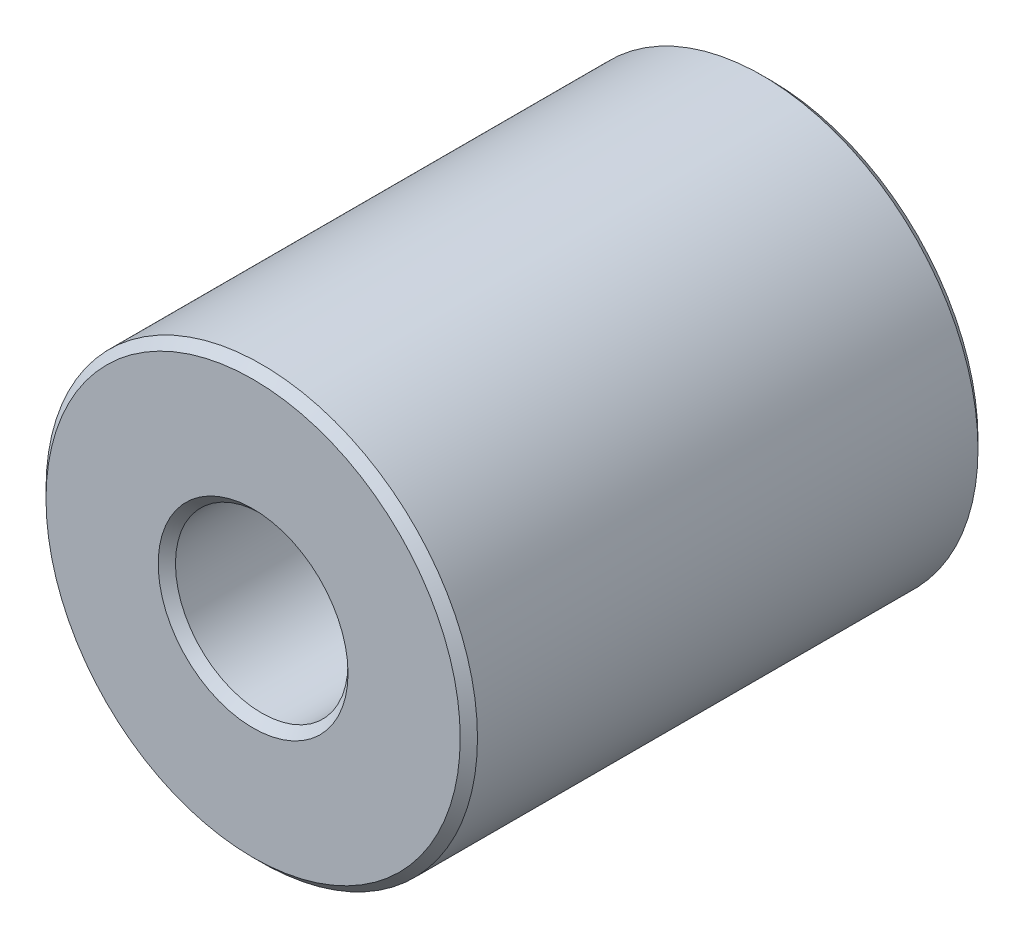
ISO-10303-21;
HEADER;
FILE_DESCRIPTION(('STEP AP214'),'2;1');
FILE_NAME('part.step','',(''),(''),'','','');
FILE_SCHEMA(('AUTOMOTIVE_DESIGN { 1 0 10303 214 1 1 1 1 }'));
ENDSEC;
DATA;
#1=APPLICATION_CONTEXT('core data for automotive mechanical design processes');
#2=APPLICATION_PROTOCOL_DEFINITION('international standard','automotive_design',2000,#1);
#3=PRODUCT_CONTEXT('',#1,'mechanical');
#4=PRODUCT('Part','Part','',(#3));
#5=PRODUCT_RELATED_PRODUCT_CATEGORY('part','',(#4));
#6=PRODUCT_DEFINITION_FORMATION('','',#4);
#7=PRODUCT_DEFINITION_CONTEXT('part definition',#1,'design');
#8=PRODUCT_DEFINITION('design','',#6,#7);
#9=PRODUCT_DEFINITION_SHAPE('','',#8);
#10=(LENGTH_UNIT() NAMED_UNIT(*) SI_UNIT(.MILLI.,.METRE.));
#11=(NAMED_UNIT(*) PLANE_ANGLE_UNIT() SI_UNIT($,.RADIAN.));
#12=(NAMED_UNIT(*) SI_UNIT($,.STERADIAN.) SOLID_ANGLE_UNIT());
#13=UNCERTAINTY_MEASURE_WITH_UNIT(LENGTH_MEASURE(1.E-05),#10,'distance_accuracy_value','');
#14=(GEOMETRIC_REPRESENTATION_CONTEXT(3) GLOBAL_UNCERTAINTY_ASSIGNED_CONTEXT((#13)) GLOBAL_UNIT_ASSIGNED_CONTEXT((#10,
#11,#12)) REPRESENTATION_CONTEXT('',''));
#15=CARTESIAN_POINT('',(0.,0.,0.));
#16=DIRECTION('',(0.,0.,1.));
#17=DIRECTION('',(1.,0.,0.));
#18=AXIS2_PLACEMENT_3D('',#15,#16,#17);
#19=CARTESIAN_POINT('',(0.,0.,30.));
#20=DIRECTION('',(0.,0.,-1.));
#21=DIRECTION('',(-1.,0.,0.));
#22=AXIS2_PLACEMENT_3D('',#19,#20,#21);
#23=CYLINDRICAL_SURFACE('',#22,12.5);
#24=CARTESIAN_POINT('',(0.,0.,29.5));
#25=DIRECTION('',(0.,0.,1.));
#26=DIRECTION('',(1.,0.,0.));
#27=AXIS2_PLACEMENT_3D('',#24,#25,#26);
#28=CIRCLE('',#27,12.5);
#29=CARTESIAN_POINT('',(12.5,0.,29.5));
#30=VERTEX_POINT('',#29);
#31=EDGE_CURVE('E55',#30,#30,#28,.F.);
#32=ORIENTED_EDGE('',*,*,#31,.T.);
#33=EDGE_LOOP('',(#32));
#34=FACE_BOUND('',#33,.T.);
#35=CARTESIAN_POINT('',(0.,0.,0.499999999999994));
#36=DIRECTION('',(0.,0.,1.));
#37=DIRECTION('',(1.,0.,0.));
#38=AXIS2_PLACEMENT_3D('',#35,#36,#37);
#39=CIRCLE('',#38,12.5);
#40=CARTESIAN_POINT('',(12.5,0.,0.499999999999994));
#41=VERTEX_POINT('',#40);
#42=EDGE_CURVE('E60',#41,#41,#39,.T.);
#43=ORIENTED_EDGE('',*,*,#42,.T.);
#44=EDGE_LOOP('',(#43));
#45=FACE_BOUND('',#44,.T.);
#46=ADVANCED_FACE('F41',(#34,#45),#23,.T.);
#47=CARTESIAN_POINT('',(0.,0.,30.));
#48=DIRECTION('',(0.,0.,1.));
#49=DIRECTION('',(1.,0.,0.));
#50=AXIS2_PLACEMENT_3D('',#47,#48,#49);
#51=PLANE('',#50);
#52=CARTESIAN_POINT('',(0.,0.,30.));
#53=DIRECTION('',(0.,0.,1.));
#54=DIRECTION('',(1.,0.,0.));
#55=AXIS2_PLACEMENT_3D('',#52,#53,#54);
#56=CIRCLE('',#55,12.);
#57=CARTESIAN_POINT('',(12.,0.,30.));
#58=VERTEX_POINT('',#57);
#59=EDGE_CURVE('E66',#58,#58,#56,.T.);
#60=ORIENTED_EDGE('',*,*,#59,.T.);
#61=EDGE_LOOP('',(#60));
#62=FACE_BOUND('',#61,.T.);
#63=CARTESIAN_POINT('',(0.,0.,30.));
#64=DIRECTION('',(0.,0.,1.));
#65=DIRECTION('',(1.,0.,0.));
#66=AXIS2_PLACEMENT_3D('',#63,#64,#65);
#67=CIRCLE('',#66,5.5);
#68=CARTESIAN_POINT('',(5.5,0.,30.));
#69=VERTEX_POINT('',#68);
#70=EDGE_CURVE('E70',#69,#69,#67,.F.);
#71=ORIENTED_EDGE('',*,*,#70,.T.);
#72=EDGE_LOOP('',(#71));
#73=FACE_BOUND('',#72,.T.);
#74=ADVANCED_FACE('F91',(#62,#73),#51,.T.);
#75=CARTESIAN_POINT('',(0.,0.,0.));
#76=DIRECTION('',(0.,0.,1.));
#77=DIRECTION('',(1.,0.,0.));
#78=AXIS2_PLACEMENT_3D('',#75,#76,#77);
#79=PLANE('',#78);
#80=CARTESIAN_POINT('',(0.,0.,0.));
#81=DIRECTION('',(0.,0.,1.));
#82=DIRECTION('',(1.,0.,0.));
#83=AXIS2_PLACEMENT_3D('',#80,#81,#82);
#84=CIRCLE('',#83,12.);
#85=CARTESIAN_POINT('',(12.,0.,0.));
#86=VERTEX_POINT('',#85);
#87=EDGE_CURVE('E10',#86,#86,#84,.F.);
#88=ORIENTED_EDGE('',*,*,#87,.T.);
#89=EDGE_LOOP('',(#88));
#90=FACE_BOUND('',#89,.T.);
#91=ADVANCED_FACE('F83',(#90),#79,.F.);
#92=CARTESIAN_POINT('',(0.,0.,5.));
#93=DIRECTION('',(0.,0.,1.));
#94=DIRECTION('',(1.,0.,0.));
#95=AXIS2_PLACEMENT_3D('',#92,#93,#94);
#96=CYLINDRICAL_SURFACE('',#95,5.);
#97=CARTESIAN_POINT('',(0.,0.,29.5));
#98=DIRECTION('',(0.,0.,1.));
#99=DIRECTION('',(1.,0.,0.));
#100=AXIS2_PLACEMENT_3D('',#97,#98,#99);
#101=CIRCLE('',#100,5.);
#102=CARTESIAN_POINT('',(5.,0.,29.5));
#103=VERTEX_POINT('',#102);
#104=EDGE_CURVE('E50',#103,#103,#101,.T.);
#105=ORIENTED_EDGE('',*,*,#104,.T.);
#106=EDGE_LOOP('',(#105));
#107=FACE_BOUND('',#106,.T.);
#108=CARTESIAN_POINT('',(0.,0.,5.));
#109=DIRECTION('',(0.,0.,1.));
#110=DIRECTION('',(1.,0.,0.));
#111=AXIS2_PLACEMENT_3D('',#108,#109,#110);
#112=CIRCLE('',#111,5.);
#113=CARTESIAN_POINT('',(5.,0.,5.));
#114=VERTEX_POINT('',#113);
#115=EDGE_CURVE('E74',#114,#114,#112,.T.);
#116=ORIENTED_EDGE('',*,*,#115,.F.);
#117=EDGE_LOOP('',(#116));
#118=FACE_BOUND('',#117,.T.);
#119=ADVANCED_FACE('F81',(#107,#118),#96,.F.);
#120=CARTESIAN_POINT('',(0.,0.,5.));
#121=DIRECTION('',(0.,0.,1.));
#122=DIRECTION('',(1.,0.,0.));
#123=AXIS2_PLACEMENT_3D('',#120,#121,#122);
#124=PLANE('',#123);
#125=ORIENTED_EDGE('',*,*,#115,.T.);
#126=EDGE_LOOP('',(#125));
#127=FACE_BOUND('',#126,.T.);
#128=ADVANCED_FACE('F79',(#127),#124,.T.);
#129=CARTESIAN_POINT('',(0.,0.,30.));
#130=DIRECTION('',(0.,0.,-1.));
#131=DIRECTION('',(-1.,0.,0.));
#132=AXIS2_PLACEMENT_3D('',#129,#130,#131);
#133=CONICAL_SURFACE('',#132,12.,0.785398163397445);
#134=ORIENTED_EDGE('',*,*,#31,.F.);
#135=EDGE_LOOP('',(#134));
#136=FACE_BOUND('',#135,.T.);
#137=ORIENTED_EDGE('',*,*,#59,.F.);
#138=EDGE_LOOP('',(#137));
#139=FACE_BOUND('',#138,.T.);
#140=ADVANCED_FACE('F89',(#136,#139),#133,.T.);
#141=CARTESIAN_POINT('',(0.,0.,29.5));
#142=DIRECTION('',(0.,0.,1.));
#143=DIRECTION('',(1.,0.,0.));
#144=AXIS2_PLACEMENT_3D('',#141,#142,#143);
#145=CONICAL_SURFACE('',#144,5.,0.785398163397453);
#146=ORIENTED_EDGE('',*,*,#70,.F.);
#147=EDGE_LOOP('',(#146));
#148=FACE_BOUND('',#147,.T.);
#149=ORIENTED_EDGE('',*,*,#104,.F.);
#150=EDGE_LOOP('',(#149));
#151=FACE_BOUND('',#150,.T.);
#152=ADVANCED_FACE('F108',(#148,#151),#145,.F.);
#153=CARTESIAN_POINT('',(0.,0.,0.499999999999994));
#154=DIRECTION('',(0.,0.,1.));
#155=DIRECTION('',(1.,0.,0.));
#156=AXIS2_PLACEMENT_3D('',#153,#154,#155);
#157=CONICAL_SURFACE('',#156,12.5,0.785398163397448);
#158=ORIENTED_EDGE('',*,*,#87,.F.);
#159=EDGE_LOOP('',(#158));
#160=FACE_BOUND('',#159,.T.);
#161=ORIENTED_EDGE('',*,*,#42,.F.);
#162=EDGE_LOOP('',(#161));
#163=FACE_BOUND('',#162,.T.);
#164=ADVANCED_FACE('F44',(#160,#163),#157,.T.);
#165=CLOSED_SHELL('',(#46,#74,#91,#119,#128,#140,#152,#164));
#166=MANIFOLD_SOLID_BREP('B2',#165);
#167=ADVANCED_BREP_SHAPE_REPRESENTATION('',(#18,#166),#14);
#168=SHAPE_DEFINITION_REPRESENTATION(#9,#167);
ENDSEC;
END-ISO-10303-21;
